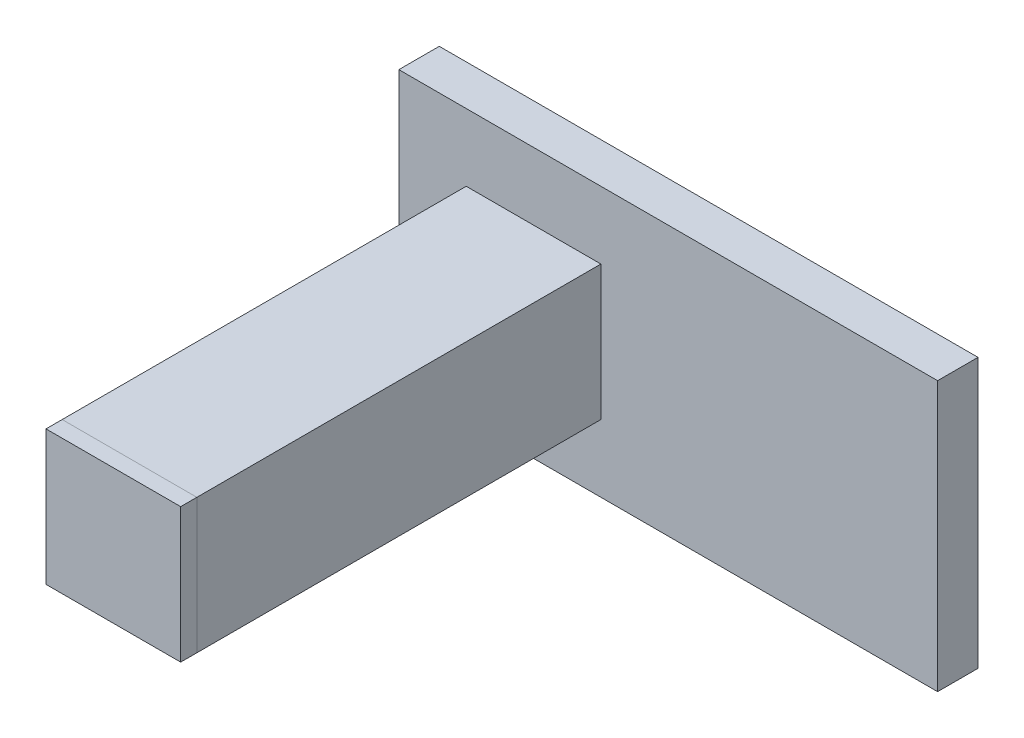
ISO-10303-21;
HEADER;
FILE_DESCRIPTION(('STEP AP214'),'2;1');
FILE_NAME('part.step','',(''),(''),'','','');
FILE_SCHEMA(('AUTOMOTIVE_DESIGN { 1 0 10303 214 1 1 1 1 }'));
ENDSEC;
DATA;
#1=APPLICATION_CONTEXT('core data for automotive mechanical design processes');
#2=APPLICATION_PROTOCOL_DEFINITION('international standard','automotive_design',2000,#1);
#3=PRODUCT_CONTEXT('',#1,'mechanical');
#4=PRODUCT('Part','Part','',(#3));
#5=PRODUCT_RELATED_PRODUCT_CATEGORY('part','',(#4));
#6=PRODUCT_DEFINITION_FORMATION('','',#4);
#7=PRODUCT_DEFINITION_CONTEXT('part definition',#1,'design');
#8=PRODUCT_DEFINITION('design','',#6,#7);
#9=PRODUCT_DEFINITION_SHAPE('','',#8);
#10=(LENGTH_UNIT() NAMED_UNIT(*) SI_UNIT(.MILLI.,.METRE.));
#11=(NAMED_UNIT(*) PLANE_ANGLE_UNIT() SI_UNIT($,.RADIAN.));
#12=(NAMED_UNIT(*) SI_UNIT($,.STERADIAN.) SOLID_ANGLE_UNIT());
#13=UNCERTAINTY_MEASURE_WITH_UNIT(LENGTH_MEASURE(1.E-05),#10,'distance_accuracy_value','');
#14=(GEOMETRIC_REPRESENTATION_CONTEXT(3) GLOBAL_UNCERTAINTY_ASSIGNED_CONTEXT((#13)) GLOBAL_UNIT_ASSIGNED_CONTEXT((#10,
#11,#12)) REPRESENTATION_CONTEXT('',''));
#15=CARTESIAN_POINT('',(0.,0.,0.));
#16=DIRECTION('',(0.,0.,1.));
#17=DIRECTION('',(1.,0.,0.));
#18=AXIS2_PLACEMENT_3D('',#15,#16,#17);
#19=CARTESIAN_POINT('',(-25.,25.,165.));
#20=DIRECTION('',(1.,0.,0.));
#21=DIRECTION('',(0.,1.,0.));
#22=AXIS2_PLACEMENT_3D('',#19,#20,#21);
#23=PLANE('',#22);
#24=DIRECTION('',(0.,-1.,0.));
#25=VECTOR('',#24,1.);
#26=CARTESIAN_POINT('',(-25.,25.,15.));
#27=LINE('',#26,#25);
#28=CARTESIAN_POINT('',(-25.,25.,15.));
#29=VERTEX_POINT('',#28);
#30=CARTESIAN_POINT('',(-25.,-25.,15.));
#31=VERTEX_POINT('',#30);
#32=EDGE_CURVE('E321',#29,#31,#27,.T.);
#33=ORIENTED_EDGE('',*,*,#32,.T.);
#34=DIRECTION('',(0.,0.,-1.));
#35=VECTOR('',#34,1.);
#36=CARTESIAN_POINT('',(-25.,-25.,165.));
#37=LINE('',#36,#35);
#38=CARTESIAN_POINT('',(-24.999975,-24.999975,165.));
#39=VERTEX_POINT('',#38);
#40=EDGE_CURVE('E11',#39,#31,#37,.T.);
#41=ORIENTED_EDGE('',*,*,#40,.F.);
#42=CARTESIAN_POINT('',(-24.99995,24.99995,165.));
#43=DIRECTION('',(0.,-1.,0.));
#44=VECTOR('',#43,1.);
#45=LINE('',#42,#44);
#46=CARTESIAN_POINT('',(-24.999975,24.999975,165.));
#47=VERTEX_POINT('',#46);
#48=EDGE_CURVE('E280',#47,#39,#45,.T.);
#49=ORIENTED_EDGE('',*,*,#48,.F.);
#50=DIRECTION('',(0.,0.,-1.));
#51=VECTOR('',#50,1.);
#52=CARTESIAN_POINT('',(-25.,25.,165.));
#53=LINE('',#52,#51);
#54=EDGE_CURVE('E275',#47,#29,#53,.T.);
#55=ORIENTED_EDGE('',*,*,#54,.T.);
#56=EDGE_LOOP('',(#33,#41,#49,#55));
#57=FACE_BOUND('',#56,.T.);
#58=ADVANCED_FACE('F35',(#57),#23,.F.);
#59=CARTESIAN_POINT('',(-25.,-25.,165.));
#60=DIRECTION('',(0.,1.,0.));
#61=DIRECTION('',(0.,0.,1.));
#62=AXIS2_PLACEMENT_3D('',#59,#60,#61);
#63=PLANE('',#62);
#64=DIRECTION('',(1.,0.,0.));
#65=VECTOR('',#64,1.);
#66=CARTESIAN_POINT('',(-25.,-25.,15.));
#67=LINE('',#66,#65);
#68=CARTESIAN_POINT('',(25.,-25.,15.));
#69=VERTEX_POINT('',#68);
#70=EDGE_CURVE('E322',#31,#69,#67,.T.);
#71=ORIENTED_EDGE('',*,*,#70,.T.);
#72=DIRECTION('',(0.,0.,-1.));
#73=VECTOR('',#72,1.);
#74=CARTESIAN_POINT('',(25.,-25.,165.));
#75=LINE('',#74,#73);
#76=CARTESIAN_POINT('',(24.999975,-24.999975,165.));
#77=VERTEX_POINT('',#76);
#78=EDGE_CURVE('E47',#77,#69,#75,.T.);
#79=ORIENTED_EDGE('',*,*,#78,.F.);
#80=CARTESIAN_POINT('',(-24.99995,-24.99995,165.));
#81=DIRECTION('',(1.,0.,0.));
#82=VECTOR('',#81,1.);
#83=LINE('',#80,#82);
#84=EDGE_CURVE('E172',#39,#77,#83,.T.);
#85=ORIENTED_EDGE('',*,*,#84,.F.);
#86=ORIENTED_EDGE('',*,*,#40,.T.);
#87=EDGE_LOOP('',(#71,#79,#85,#86));
#88=FACE_BOUND('',#87,.T.);
#89=ADVANCED_FACE('F261',(#88),#63,.F.);
#90=CARTESIAN_POINT('',(25.,25.,165.));
#91=DIRECTION('',(-1.,0.,0.));
#92=DIRECTION('',(0.,-1.,0.));
#93=AXIS2_PLACEMENT_3D('',#90,#91,#92);
#94=PLANE('',#93);
#95=DIRECTION('',(0.,1.,0.));
#96=VECTOR('',#95,1.);
#97=CARTESIAN_POINT('',(25.,25.,15.));
#98=LINE('',#97,#96);
#99=CARTESIAN_POINT('',(25.,25.,15.));
#100=VERTEX_POINT('',#99);
#101=EDGE_CURVE('E76',#69,#100,#98,.T.);
#102=ORIENTED_EDGE('',*,*,#101,.T.);
#103=DIRECTION('',(0.,0.,-1.));
#104=VECTOR('',#103,1.);
#105=CARTESIAN_POINT('',(25.,25.,165.));
#106=LINE('',#105,#104);
#107=CARTESIAN_POINT('',(24.999975,24.999975,165.));
#108=VERTEX_POINT('',#107);
#109=EDGE_CURVE('E64',#108,#100,#106,.T.);
#110=ORIENTED_EDGE('',*,*,#109,.F.);
#111=CARTESIAN_POINT('',(24.99995,-24.99995,165.));
#112=DIRECTION('',(0.,1.,0.));
#113=VECTOR('',#112,1.);
#114=LINE('',#111,#113);
#115=EDGE_CURVE('E175',#77,#108,#114,.T.);
#116=ORIENTED_EDGE('',*,*,#115,.F.);
#117=ORIENTED_EDGE('',*,*,#78,.T.);
#118=EDGE_LOOP('',(#102,#110,#116,#117));
#119=FACE_BOUND('',#118,.T.);
#120=ADVANCED_FACE('F257',(#119),#94,.F.);
#121=CARTESIAN_POINT('',(-25.,25.,165.));
#122=DIRECTION('',(0.,-1.,0.));
#123=DIRECTION('',(0.,0.,-1.));
#124=AXIS2_PLACEMENT_3D('',#121,#122,#123);
#125=PLANE('',#124);
#126=DIRECTION('',(-1.,0.,0.));
#127=VECTOR('',#126,1.);
#128=CARTESIAN_POINT('',(-25.,25.,15.));
#129=LINE('',#128,#127);
#130=EDGE_CURVE('E332',#100,#29,#129,.T.);
#131=ORIENTED_EDGE('',*,*,#130,.T.);
#132=ORIENTED_EDGE('',*,*,#54,.F.);
#133=CARTESIAN_POINT('',(24.99995,24.99995,165.));
#134=DIRECTION('',(-1.,0.,0.));
#135=VECTOR('',#134,1.);
#136=LINE('',#133,#135);
#137=EDGE_CURVE('E192',#108,#47,#136,.T.);
#138=ORIENTED_EDGE('',*,*,#137,.F.);
#139=ORIENTED_EDGE('',*,*,#109,.T.);
#140=EDGE_LOOP('',(#131,#132,#138,#139));
#141=FACE_BOUND('',#140,.T.);
#142=ADVANCED_FACE('F236',(#141),#125,.F.);
#143=CARTESIAN_POINT('',(150.,-50.,15.));
#144=DIRECTION('',(-1.,0.,0.));
#145=DIRECTION('',(0.,0.,1.));
#146=AXIS2_PLACEMENT_3D('',#143,#144,#145);
#147=PLANE('',#146);
#148=DIRECTION('',(0.,1.,0.));
#149=VECTOR('',#148,1.);
#150=CARTESIAN_POINT('',(150.,-50.,0.));
#151=LINE('',#150,#149);
#152=CARTESIAN_POINT('',(150.,-50.,0.));
#153=VERTEX_POINT('',#152);
#154=CARTESIAN_POINT('',(150.,50.,0.));
#155=VERTEX_POINT('',#154);
#156=EDGE_CURVE('E177',#153,#155,#151,.T.);
#157=ORIENTED_EDGE('',*,*,#156,.T.);
#158=DIRECTION('',(0.,0.,-1.));
#159=VECTOR('',#158,1.);
#160=CARTESIAN_POINT('',(150.,50.,15.));
#161=LINE('',#160,#159);
#162=CARTESIAN_POINT('',(150.,50.,15.));
#163=VERTEX_POINT('',#162);
#164=EDGE_CURVE('E370',#163,#155,#161,.T.);
#165=ORIENTED_EDGE('',*,*,#164,.F.);
#166=DIRECTION('',(0.,1.,0.));
#167=VECTOR('',#166,1.);
#168=CARTESIAN_POINT('',(150.,-50.,15.));
#169=LINE('',#168,#167);
#170=CARTESIAN_POINT('',(150.,-50.,15.));
#171=VERTEX_POINT('',#170);
#172=EDGE_CURVE('E197',#171,#163,#169,.T.);
#173=ORIENTED_EDGE('',*,*,#172,.F.);
#174=DIRECTION('',(0.,0.,-1.));
#175=VECTOR('',#174,1.);
#176=CARTESIAN_POINT('',(150.,-50.,15.));
#177=LINE('',#176,#175);
#178=EDGE_CURVE('E555',#171,#153,#177,.T.);
#179=ORIENTED_EDGE('',*,*,#178,.T.);
#180=EDGE_LOOP('',(#157,#165,#173,#179));
#181=FACE_BOUND('',#180,.T.);
#182=ADVANCED_FACE('F232',(#181),#147,.F.);
#183=CARTESIAN_POINT('',(-50.,50.,15.));
#184=DIRECTION('',(0.,-1.,0.));
#185=DIRECTION('',(0.,0.,-1.));
#186=AXIS2_PLACEMENT_3D('',#183,#184,#185);
#187=PLANE('',#186);
#188=DIRECTION('',(-1.,0.,0.));
#189=VECTOR('',#188,1.);
#190=CARTESIAN_POINT('',(-50.,50.,0.));
#191=LINE('',#190,#189);
#192=CARTESIAN_POINT('',(-50.,50.,0.));
#193=VERTEX_POINT('',#192);
#194=EDGE_CURVE('E180',#155,#193,#191,.T.);
#195=ORIENTED_EDGE('',*,*,#194,.T.);
#196=DIRECTION('',(0.,0.,-1.));
#197=VECTOR('',#196,1.);
#198=CARTESIAN_POINT('',(-50.,50.,15.));
#199=LINE('',#198,#197);
#200=CARTESIAN_POINT('',(-50.,50.,15.));
#201=VERTEX_POINT('',#200);
#202=EDGE_CURVE('E373',#201,#193,#199,.T.);
#203=ORIENTED_EDGE('',*,*,#202,.F.);
#204=DIRECTION('',(-1.,0.,0.));
#205=VECTOR('',#204,1.);
#206=CARTESIAN_POINT('',(-50.,50.,15.));
#207=LINE('',#206,#205);
#208=EDGE_CURVE('E362',#163,#201,#207,.T.);
#209=ORIENTED_EDGE('',*,*,#208,.F.);
#210=ORIENTED_EDGE('',*,*,#164,.T.);
#211=EDGE_LOOP('',(#195,#203,#209,#210));
#212=FACE_BOUND('',#211,.T.);
#213=ADVANCED_FACE('F228',(#212),#187,.F.);
#214=CARTESIAN_POINT('',(-50.,-50.,15.));
#215=DIRECTION('',(1.,0.,0.));
#216=DIRECTION('',(0.,0.,-1.));
#217=AXIS2_PLACEMENT_3D('',#214,#215,#216);
#218=PLANE('',#217);
#219=DIRECTION('',(0.,-1.,0.));
#220=VECTOR('',#219,1.);
#221=CARTESIAN_POINT('',(-50.,-50.,0.));
#222=LINE('',#221,#220);
#223=CARTESIAN_POINT('',(-50.,-50.,0.));
#224=VERTEX_POINT('',#223);
#225=EDGE_CURVE('E558',#193,#224,#222,.T.);
#226=ORIENTED_EDGE('',*,*,#225,.T.);
#227=DIRECTION('',(0.,0.,-1.));
#228=VECTOR('',#227,1.);
#229=CARTESIAN_POINT('',(-50.,-50.,15.));
#230=LINE('',#229,#228);
#231=CARTESIAN_POINT('',(-50.,-50.,15.));
#232=VERTEX_POINT('',#231);
#233=EDGE_CURVE('E379',#232,#224,#230,.T.);
#234=ORIENTED_EDGE('',*,*,#233,.F.);
#235=DIRECTION('',(0.,-1.,0.));
#236=VECTOR('',#235,1.);
#237=CARTESIAN_POINT('',(-50.,-50.,15.));
#238=LINE('',#237,#236);
#239=EDGE_CURVE('E562',#201,#232,#238,.T.);
#240=ORIENTED_EDGE('',*,*,#239,.F.);
#241=ORIENTED_EDGE('',*,*,#202,.T.);
#242=EDGE_LOOP('',(#226,#234,#240,#241));
#243=FACE_BOUND('',#242,.T.);
#244=ADVANCED_FACE('F224',(#243),#218,.F.);
#245=CARTESIAN_POINT('',(-50.,-50.,15.));
#246=DIRECTION('',(0.,1.,0.));
#247=DIRECTION('',(0.,0.,1.));
#248=AXIS2_PLACEMENT_3D('',#245,#246,#247);
#249=PLANE('',#248);
#250=DIRECTION('',(1.,0.,0.));
#251=VECTOR('',#250,1.);
#252=CARTESIAN_POINT('',(-50.,-50.,0.));
#253=LINE('',#252,#251);
#254=EDGE_CURVE('E368',#224,#153,#253,.T.);
#255=ORIENTED_EDGE('',*,*,#254,.T.);
#256=ORIENTED_EDGE('',*,*,#178,.F.);
#257=DIRECTION('',(1.,0.,0.));
#258=VECTOR('',#257,1.);
#259=CARTESIAN_POINT('',(-50.,-50.,15.));
#260=LINE('',#259,#258);
#261=EDGE_CURVE('E365',#232,#171,#260,.T.);
#262=ORIENTED_EDGE('',*,*,#261,.F.);
#263=ORIENTED_EDGE('',*,*,#233,.T.);
#264=EDGE_LOOP('',(#255,#256,#262,#263));
#265=FACE_BOUND('',#264,.T.);
#266=ADVANCED_FACE('F217',(#265),#249,.F.);
#267=CARTESIAN_POINT('',(50.,0.,15.));
#268=DIRECTION('',(0.,0.,-1.));
#269=DIRECTION('',(-1.,0.,0.));
#270=AXIS2_PLACEMENT_3D('',#267,#268,#269);
#271=PLANE('',#270);
#272=ORIENTED_EDGE('',*,*,#32,.F.);
#273=ORIENTED_EDGE('',*,*,#130,.F.);
#274=ORIENTED_EDGE('',*,*,#101,.F.);
#275=ORIENTED_EDGE('',*,*,#70,.F.);
#276=EDGE_LOOP('',(#272,#273,#274,#275));
#277=FACE_BOUND('',#276,.T.);
#278=ORIENTED_EDGE('',*,*,#172,.T.);
#279=ORIENTED_EDGE('',*,*,#208,.T.);
#280=ORIENTED_EDGE('',*,*,#239,.T.);
#281=ORIENTED_EDGE('',*,*,#261,.T.);
#282=EDGE_LOOP('',(#278,#279,#280,#281));
#283=FACE_BOUND('',#282,.T.);
#284=ADVANCED_FACE('F214',(#277,#283),#271,.F.);
#285=CARTESIAN_POINT('',(50.,0.,0.));
#286=DIRECTION('',(0.,0.,-1.));
#287=DIRECTION('',(-1.,0.,0.));
#288=AXIS2_PLACEMENT_3D('',#285,#286,#287);
#289=PLANE('',#288);
#290=ORIENTED_EDGE('',*,*,#156,.F.);
#291=ORIENTED_EDGE('',*,*,#254,.F.);
#292=ORIENTED_EDGE('',*,*,#225,.F.);
#293=ORIENTED_EDGE('',*,*,#194,.F.);
#294=EDGE_LOOP('',(#290,#291,#292,#293));
#295=FACE_BOUND('',#294,.T.);
#296=ADVANCED_FACE('F213',(#295),#289,.T.);
#297=CARTESIAN_POINT('',(24.99995,-24.99995,171.));
#298=DIRECTION('',(-1.,0.,0.));
#299=DIRECTION('',(0.,0.,1.));
#300=AXIS2_PLACEMENT_3D('',#297,#298,#299);
#301=PLANE('',#300);
#302=ORIENTED_EDGE('',*,*,#115,.T.);
#303=DIRECTION('',(0.,0.,-1.));
#304=VECTOR('',#303,1.);
#305=CARTESIAN_POINT('',(24.99995,24.99995,171.));
#306=LINE('',#305,#304);
#307=CARTESIAN_POINT('',(24.99995,24.99995,171.));
#308=VERTEX_POINT('',#307);
#309=EDGE_CURVE('E156',#308,#108,#306,.T.);
#310=ORIENTED_EDGE('',*,*,#309,.F.);
#311=DIRECTION('',(0.,1.,0.));
#312=VECTOR('',#311,1.);
#313=CARTESIAN_POINT('',(24.99995,-24.99995,171.));
#314=LINE('',#313,#312);
#315=CARTESIAN_POINT('',(24.99995,-24.99995,171.));
#316=VERTEX_POINT('',#315);
#317=EDGE_CURVE('E163',#316,#308,#314,.T.);
#318=ORIENTED_EDGE('',*,*,#317,.F.);
#319=DIRECTION('',(0.,0.,-1.));
#320=VECTOR('',#319,1.);
#321=CARTESIAN_POINT('',(24.99995,-24.99995,171.));
#322=LINE('',#321,#320);
#323=EDGE_CURVE('E290',#316,#77,#322,.T.);
#324=ORIENTED_EDGE('',*,*,#323,.T.);
#325=EDGE_LOOP('',(#302,#310,#318,#324));
#326=FACE_BOUND('',#325,.T.);
#327=ADVANCED_FACE('F174',(#326),#301,.F.);
#328=CARTESIAN_POINT('',(-24.99995,24.99995,171.));
#329=DIRECTION('',(0.,-1.,0.));
#330=DIRECTION('',(0.,0.,-1.));
#331=AXIS2_PLACEMENT_3D('',#328,#329,#330);
#332=PLANE('',#331);
#333=ORIENTED_EDGE('',*,*,#137,.T.);
#334=DIRECTION('',(0.,0.,-1.));
#335=VECTOR('',#334,1.);
#336=CARTESIAN_POINT('',(-24.99995,24.99995,171.));
#337=LINE('',#336,#335);
#338=CARTESIAN_POINT('',(-24.99995,24.99995,171.));
#339=VERTEX_POINT('',#338);
#340=EDGE_CURVE('E159',#339,#47,#337,.T.);
#341=ORIENTED_EDGE('',*,*,#340,.F.);
#342=DIRECTION('',(-1.,0.,0.));
#343=VECTOR('',#342,1.);
#344=CARTESIAN_POINT('',(-24.99995,24.99995,171.));
#345=LINE('',#344,#343);
#346=EDGE_CURVE('E151',#308,#339,#345,.T.);
#347=ORIENTED_EDGE('',*,*,#346,.F.);
#348=ORIENTED_EDGE('',*,*,#309,.T.);
#349=EDGE_LOOP('',(#333,#341,#347,#348));
#350=FACE_BOUND('',#349,.T.);
#351=ADVANCED_FACE('F154',(#350),#332,.F.);
#352=CARTESIAN_POINT('',(-24.99995,-24.99995,171.));
#353=DIRECTION('',(1.,0.,0.));
#354=DIRECTION('',(0.,0.,-1.));
#355=AXIS2_PLACEMENT_3D('',#352,#353,#354);
#356=PLANE('',#355);
#357=ORIENTED_EDGE('',*,*,#48,.T.);
#358=DIRECTION('',(0.,0.,-1.));
#359=VECTOR('',#358,1.);
#360=CARTESIAN_POINT('',(-24.99995,-24.99995,171.));
#361=LINE('',#360,#359);
#362=CARTESIAN_POINT('',(-24.99995,-24.99995,171.));
#363=VERTEX_POINT('',#362);
#364=EDGE_CURVE('E182',#363,#39,#361,.T.);
#365=ORIENTED_EDGE('',*,*,#364,.F.);
#366=DIRECTION('',(0.,-1.,0.));
#367=VECTOR('',#366,1.);
#368=CARTESIAN_POINT('',(-24.99995,-24.99995,171.));
#369=LINE('',#368,#367);
#370=EDGE_CURVE('E162',#339,#363,#369,.T.);
#371=ORIENTED_EDGE('',*,*,#370,.F.);
#372=ORIENTED_EDGE('',*,*,#340,.T.);
#373=EDGE_LOOP('',(#357,#365,#371,#372));
#374=FACE_BOUND('',#373,.T.);
#375=ADVANCED_FACE('F207',(#374),#356,.F.);
#376=CARTESIAN_POINT('',(-24.99995,-24.99995,171.));
#377=DIRECTION('',(0.,1.,0.));
#378=DIRECTION('',(0.,0.,1.));
#379=AXIS2_PLACEMENT_3D('',#376,#377,#378);
#380=PLANE('',#379);
#381=ORIENTED_EDGE('',*,*,#84,.T.);
#382=ORIENTED_EDGE('',*,*,#323,.F.);
#383=DIRECTION('',(1.,0.,0.));
#384=VECTOR('',#383,1.);
#385=CARTESIAN_POINT('',(-24.99995,-24.99995,171.));
#386=LINE('',#385,#384);
#387=EDGE_CURVE('E168',#363,#316,#386,.T.);
#388=ORIENTED_EDGE('',*,*,#387,.F.);
#389=ORIENTED_EDGE('',*,*,#364,.T.);
#390=EDGE_LOOP('',(#381,#382,#388,#389));
#391=FACE_BOUND('',#390,.T.);
#392=ADVANCED_FACE('F289',(#391),#380,.F.);
#393=CARTESIAN_POINT('',(0.,0.,171.));
#394=DIRECTION('',(0.,0.,-1.));
#395=DIRECTION('',(-1.,0.,0.));
#396=AXIS2_PLACEMENT_3D('',#393,#394,#395);
#397=PLANE('',#396);
#398=ORIENTED_EDGE('',*,*,#317,.T.);
#399=ORIENTED_EDGE('',*,*,#346,.T.);
#400=ORIENTED_EDGE('',*,*,#370,.T.);
#401=ORIENTED_EDGE('',*,*,#387,.T.);
#402=EDGE_LOOP('',(#398,#399,#400,#401));
#403=FACE_BOUND('',#402,.T.);
#404=ADVANCED_FACE('F166',(#403),#397,.F.);
#405=CLOSED_SHELL('',(#58,#89,#120,#142,#182,#213,#244,#266,#284,#296,#327,#351,#375,#392,#404));
#406=DIRECTION('',(0.,1.,0.));
#407=VECTOR('',#406,1.);
#408=CARTESIAN_POINT('',(20.,20.,15.));
#409=LINE('',#408,#407);
#410=CARTESIAN_POINT('',(20.,-20.,15.));
#411=VERTEX_POINT('',#410);
#412=CARTESIAN_POINT('',(20.,20.,15.));
#413=VERTEX_POINT('',#412);
#414=EDGE_CURVE('E387',#411,#413,#409,.T.);
#415=ORIENTED_EDGE('',*,*,#414,.T.);
#416=DIRECTION('',(-1.,0.,0.));
#417=VECTOR('',#416,1.);
#418=CARTESIAN_POINT('',(-20.,20.,15.));
#419=LINE('',#418,#417);
#420=CARTESIAN_POINT('',(-20.,20.,15.));
#421=VERTEX_POINT('',#420);
#422=EDGE_CURVE('E372',#413,#421,#419,.T.);
#423=ORIENTED_EDGE('',*,*,#422,.T.);
#424=DIRECTION('',(0.,-1.,0.));
#425=VECTOR('',#424,1.);
#426=CARTESIAN_POINT('',(-20.,20.,15.));
#427=LINE('',#426,#425);
#428=CARTESIAN_POINT('',(-20.,-20.,15.));
#429=VERTEX_POINT('',#428);
#430=EDGE_CURVE('E376',#421,#429,#427,.T.);
#431=ORIENTED_EDGE('',*,*,#430,.T.);
#432=DIRECTION('',(1.,0.,0.));
#433=VECTOR('',#432,1.);
#434=CARTESIAN_POINT('',(-20.,-20.,15.));
#435=LINE('',#434,#433);
#436=EDGE_CURVE('E396',#429,#411,#435,.T.);
#437=ORIENTED_EDGE('',*,*,#436,.T.);
#438=EDGE_LOOP('',(#415,#423,#431,#437));
#439=FACE_BOUND('',#438,.T.);
#440=ADVANCED_FACE('F218',(#439),#271,.F.);
#441=CARTESIAN_POINT('',(-20.,-20.,165.));
#442=DIRECTION('',(0.,1.,0.));
#443=DIRECTION('',(0.,0.,1.));
#444=AXIS2_PLACEMENT_3D('',#441,#442,#443);
#445=PLANE('',#444);
#446=ORIENTED_EDGE('',*,*,#436,.F.);
#447=DIRECTION('',(0.,0.,-1.));
#448=VECTOR('',#447,1.);
#449=CARTESIAN_POINT('',(-20.,-20.,165.));
#450=LINE('',#449,#448);
#451=CARTESIAN_POINT('',(-20.,-20.,165.));
#452=VERTEX_POINT('',#451);
#453=EDGE_CURVE('E327',#452,#429,#450,.T.);
#454=ORIENTED_EDGE('',*,*,#453,.F.);
#455=DIRECTION('',(1.,0.,0.));
#456=VECTOR('',#455,1.);
#457=CARTESIAN_POINT('',(-20.,-20.,165.));
#458=LINE('',#457,#456);
#459=CARTESIAN_POINT('',(20.,-20.,165.));
#460=VERTEX_POINT('',#459);
#461=EDGE_CURVE('E390',#452,#460,#458,.T.);
#462=ORIENTED_EDGE('',*,*,#461,.T.);
#463=DIRECTION('',(0.,0.,-1.));
#464=VECTOR('',#463,1.);
#465=CARTESIAN_POINT('',(20.,-20.,165.));
#466=LINE('',#465,#464);
#467=EDGE_CURVE('E85',#460,#411,#466,.T.);
#468=ORIENTED_EDGE('',*,*,#467,.T.);
#469=EDGE_LOOP('',(#446,#454,#462,#468));
#470=FACE_BOUND('',#469,.T.);
#471=ADVANCED_FACE('F242',(#470),#445,.T.);
#472=CARTESIAN_POINT('',(20.,20.,165.));
#473=DIRECTION('',(-1.,0.,0.));
#474=DIRECTION('',(0.,-1.,0.));
#475=AXIS2_PLACEMENT_3D('',#472,#473,#474);
#476=PLANE('',#475);
#477=ORIENTED_EDGE('',*,*,#414,.F.);
#478=ORIENTED_EDGE('',*,*,#467,.F.);
#479=DIRECTION('',(0.,1.,0.));
#480=VECTOR('',#479,1.);
#481=CARTESIAN_POINT('',(20.,20.,165.));
#482=LINE('',#481,#480);
#483=CARTESIAN_POINT('',(20.,20.,165.));
#484=VERTEX_POINT('',#483);
#485=EDGE_CURVE('E55',#460,#484,#482,.T.);
#486=ORIENTED_EDGE('',*,*,#485,.T.);
#487=DIRECTION('',(0.,0.,-1.));
#488=VECTOR('',#487,1.);
#489=CARTESIAN_POINT('',(20.,20.,165.));
#490=LINE('',#489,#488);
#491=EDGE_CURVE('E392',#484,#413,#490,.T.);
#492=ORIENTED_EDGE('',*,*,#491,.T.);
#493=EDGE_LOOP('',(#477,#478,#486,#492));
#494=FACE_BOUND('',#493,.T.);
#495=ADVANCED_FACE('F238',(#494),#476,.T.);
#496=CARTESIAN_POINT('',(-20.,20.,165.));
#497=DIRECTION('',(0.,-1.,0.));
#498=DIRECTION('',(0.,0.,-1.));
#499=AXIS2_PLACEMENT_3D('',#496,#497,#498);
#500=PLANE('',#499);
#501=ORIENTED_EDGE('',*,*,#422,.F.);
#502=ORIENTED_EDGE('',*,*,#491,.F.);
#503=DIRECTION('',(-1.,0.,0.));
#504=VECTOR('',#503,1.);
#505=CARTESIAN_POINT('',(-20.,20.,165.));
#506=LINE('',#505,#504);
#507=CARTESIAN_POINT('',(-20.,20.,165.));
#508=VERTEX_POINT('',#507);
#509=EDGE_CURVE('E383',#484,#508,#506,.T.);
#510=ORIENTED_EDGE('',*,*,#509,.T.);
#511=DIRECTION('',(0.,0.,-1.));
#512=VECTOR('',#511,1.);
#513=CARTESIAN_POINT('',(-20.,20.,165.));
#514=LINE('',#513,#512);
#515=EDGE_CURVE('E323',#508,#421,#514,.T.);
#516=ORIENTED_EDGE('',*,*,#515,.T.);
#517=EDGE_LOOP('',(#501,#502,#510,#516));
#518=FACE_BOUND('',#517,.T.);
#519=ADVANCED_FACE('F241',(#518),#500,.T.);
#520=CARTESIAN_POINT('',(-20.,20.,165.));
#521=DIRECTION('',(1.,0.,0.));
#522=DIRECTION('',(0.,1.,0.));
#523=AXIS2_PLACEMENT_3D('',#520,#521,#522);
#524=PLANE('',#523);
#525=ORIENTED_EDGE('',*,*,#430,.F.);
#526=ORIENTED_EDGE('',*,*,#515,.F.);
#527=DIRECTION('',(0.,-1.,0.));
#528=VECTOR('',#527,1.);
#529=CARTESIAN_POINT('',(-20.,20.,165.));
#530=LINE('',#529,#528);
#531=EDGE_CURVE('E386',#508,#452,#530,.T.);
#532=ORIENTED_EDGE('',*,*,#531,.T.);
#533=ORIENTED_EDGE('',*,*,#453,.T.);
#534=EDGE_LOOP('',(#525,#526,#532,#533));
#535=FACE_BOUND('',#534,.T.);
#536=ADVANCED_FACE('F247',(#535),#524,.T.);
#537=CARTESIAN_POINT('',(0.,0.,165.));
#538=DIRECTION('',(0.,0.,-1.));
#539=DIRECTION('',(-1.,0.,0.));
#540=AXIS2_PLACEMENT_3D('',#537,#538,#539);
#541=PLANE('',#540);
#542=ORIENTED_EDGE('',*,*,#531,.F.);
#543=ORIENTED_EDGE('',*,*,#509,.F.);
#544=ORIENTED_EDGE('',*,*,#485,.F.);
#545=ORIENTED_EDGE('',*,*,#461,.F.);
#546=EDGE_LOOP('',(#542,#543,#544,#545));
#547=FACE_BOUND('',#546,.T.);
#548=ADVANCED_FACE('F250',(#547),#541,.T.);
#549=CLOSED_SHELL('',(#440,#471,#495,#519,#536,#548));
#550=ORIENTED_CLOSED_SHELL('',*,#549,.T.);
#551=BREP_WITH_VOIDS('B2',#405,(#550));
#552=ADVANCED_BREP_SHAPE_REPRESENTATION('',(#18,#551),#14);
#553=SHAPE_DEFINITION_REPRESENTATION(#9,#552);
ENDSEC;
END-ISO-10303-21;
